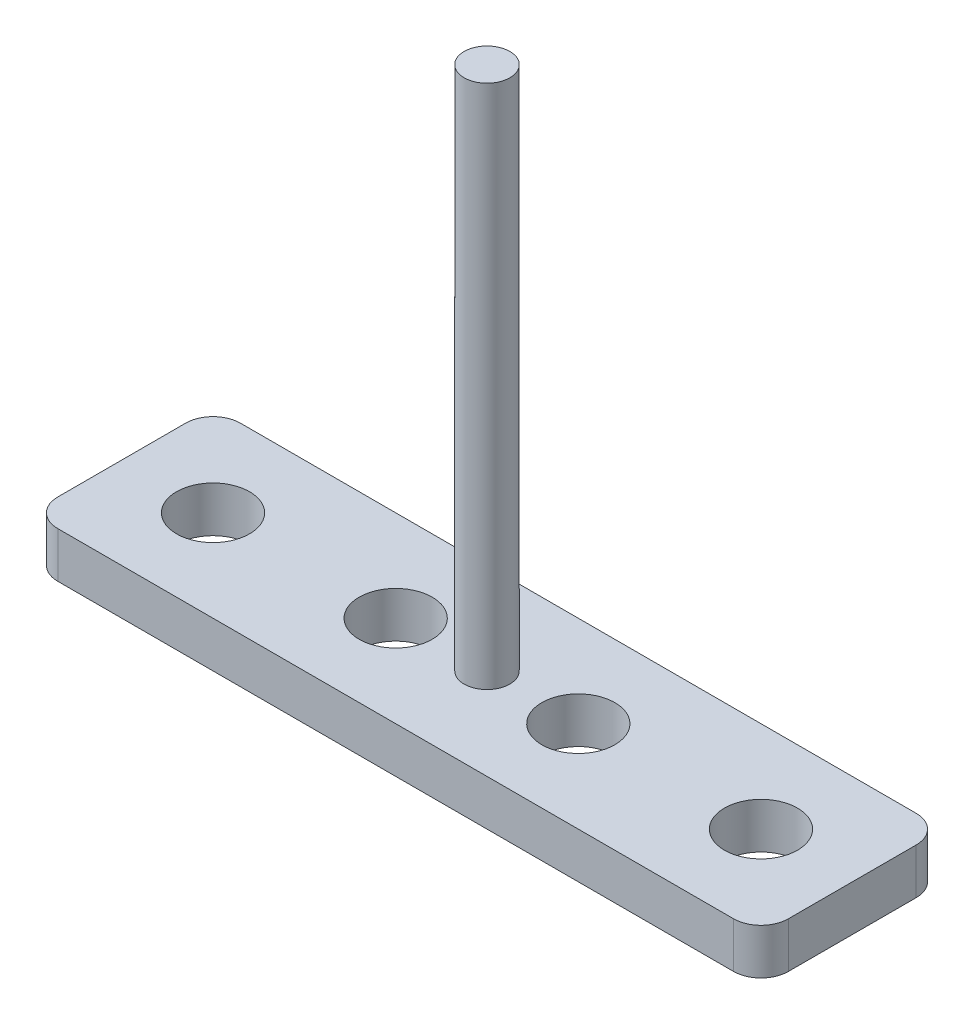
ISO-10303-21;
HEADER;
FILE_DESCRIPTION(('STEP AP214'),'2;1');
FILE_NAME('part.step','',(''),(''),'','','');
FILE_SCHEMA(('AUTOMOTIVE_DESIGN { 1 0 10303 214 1 1 1 1 }'));
ENDSEC;
DATA;
#1=APPLICATION_CONTEXT('core data for automotive mechanical design processes');
#2=APPLICATION_PROTOCOL_DEFINITION('international standard','automotive_design',2000,#1);
#3=PRODUCT_CONTEXT('',#1,'mechanical');
#4=PRODUCT('Part','Part','',(#3));
#5=PRODUCT_RELATED_PRODUCT_CATEGORY('part','',(#4));
#6=PRODUCT_DEFINITION_FORMATION('','',#4);
#7=PRODUCT_DEFINITION_CONTEXT('part definition',#1,'design');
#8=PRODUCT_DEFINITION('design','',#6,#7);
#9=PRODUCT_DEFINITION_SHAPE('','',#8);
#10=(LENGTH_UNIT() NAMED_UNIT(*) SI_UNIT(.MILLI.,.METRE.));
#11=(NAMED_UNIT(*) PLANE_ANGLE_UNIT() SI_UNIT($,.RADIAN.));
#12=(NAMED_UNIT(*) SI_UNIT($,.STERADIAN.) SOLID_ANGLE_UNIT());
#13=UNCERTAINTY_MEASURE_WITH_UNIT(LENGTH_MEASURE(1.E-05),#10,'distance_accuracy_value','');
#14=(GEOMETRIC_REPRESENTATION_CONTEXT(3) GLOBAL_UNCERTAINTY_ASSIGNED_CONTEXT((#13)) GLOBAL_UNIT_ASSIGNED_CONTEXT((#10,
#11,#12)) REPRESENTATION_CONTEXT('',''));
#15=CARTESIAN_POINT('',(0.,0.,0.));
#16=DIRECTION('',(0.,0.,1.));
#17=DIRECTION('',(1.,0.,0.));
#18=AXIS2_PLACEMENT_3D('',#15,#16,#17);
#19=CARTESIAN_POINT('',(40.,2.5,10.));
#20=DIRECTION('',(-1.,0.,0.));
#21=DIRECTION('',(0.,0.,1.));
#22=AXIS2_PLACEMENT_3D('',#19,#20,#21);
#23=PLANE('',#22);
#24=DIRECTION('',(0.,0.,-1.));
#25=VECTOR('',#24,1.);
#26=CARTESIAN_POINT('',(40.,-2.5,10.));
#27=LINE('',#26,#25);
#28=CARTESIAN_POINT('',(40.,-2.5,7.));
#29=VERTEX_POINT('',#28);
#30=CARTESIAN_POINT('',(40.,-2.5,-7.));
#31=VERTEX_POINT('',#30);
#32=EDGE_CURVE('E136',#29,#31,#27,.T.);
#33=ORIENTED_EDGE('',*,*,#32,.T.);
#34=DIRECTION('',(0.,-1.,0.));
#35=VECTOR('',#34,1.);
#36=CARTESIAN_POINT('',(40.,2.5,-7.));
#37=LINE('',#36,#35);
#38=CARTESIAN_POINT('',(40.,2.5,-7.));
#39=VERTEX_POINT('',#38);
#40=EDGE_CURVE('E111',#31,#39,#37,.F.);
#41=ORIENTED_EDGE('',*,*,#40,.T.);
#42=DIRECTION('',(0.,0.,-1.));
#43=VECTOR('',#42,1.);
#44=CARTESIAN_POINT('',(40.,2.5,10.));
#45=LINE('',#44,#43);
#46=CARTESIAN_POINT('',(40.,2.5,7.));
#47=VERTEX_POINT('',#46);
#48=EDGE_CURVE('E149',#47,#39,#45,.T.);
#49=ORIENTED_EDGE('',*,*,#48,.F.);
#50=DIRECTION('',(0.,-1.,0.));
#51=VECTOR('',#50,1.);
#52=CARTESIAN_POINT('',(40.,2.5,7.));
#53=LINE('',#52,#51);
#54=EDGE_CURVE('E117',#47,#29,#53,.T.);
#55=ORIENTED_EDGE('',*,*,#54,.T.);
#56=EDGE_LOOP('',(#33,#41,#49,#55));
#57=FACE_BOUND('',#56,.T.);
#58=ADVANCED_FACE('F39',(#57),#23,.F.);
#59=CARTESIAN_POINT('',(-40.,2.5,-10.));
#60=DIRECTION('',(0.,0.,1.));
#61=DIRECTION('',(1.,0.,0.));
#62=AXIS2_PLACEMENT_3D('',#59,#60,#61);
#63=PLANE('',#62);
#64=DIRECTION('',(-1.,0.,0.));
#65=VECTOR('',#64,1.);
#66=CARTESIAN_POINT('',(-40.,2.5,-10.));
#67=LINE('',#66,#65);
#68=CARTESIAN_POINT('',(37.,2.5,-10.));
#69=VERTEX_POINT('',#68);
#70=CARTESIAN_POINT('',(-37.,2.5,-10.));
#71=VERTEX_POINT('',#70);
#72=EDGE_CURVE('E127',#69,#71,#67,.T.);
#73=ORIENTED_EDGE('',*,*,#72,.F.);
#74=DIRECTION('',(0.,-1.,0.));
#75=VECTOR('',#74,1.);
#76=CARTESIAN_POINT('',(37.,2.5,-10.));
#77=LINE('',#76,#75);
#78=CARTESIAN_POINT('',(37.,-2.5,-10.));
#79=VERTEX_POINT('',#78);
#80=EDGE_CURVE('E110',#69,#79,#77,.T.);
#81=ORIENTED_EDGE('',*,*,#80,.T.);
#82=DIRECTION('',(-1.,0.,0.));
#83=VECTOR('',#82,1.);
#84=CARTESIAN_POINT('',(-40.,-2.5,-10.));
#85=LINE('',#84,#83);
#86=CARTESIAN_POINT('',(-37.,-2.5,-10.));
#87=VERTEX_POINT('',#86);
#88=EDGE_CURVE('E124',#79,#87,#85,.T.);
#89=ORIENTED_EDGE('',*,*,#88,.T.);
#90=DIRECTION('',(0.,-1.,0.));
#91=VECTOR('',#90,1.);
#92=CARTESIAN_POINT('',(-37.,2.5,-10.));
#93=LINE('',#92,#91);
#94=EDGE_CURVE('E130',#87,#71,#93,.F.);
#95=ORIENTED_EDGE('',*,*,#94,.T.);
#96=EDGE_LOOP('',(#73,#81,#89,#95));
#97=FACE_BOUND('',#96,.T.);
#98=ADVANCED_FACE('F123',(#97),#63,.F.);
#99=CARTESIAN_POINT('',(-40.,2.5,10.));
#100=DIRECTION('',(1.,0.,0.));
#101=DIRECTION('',(0.,0.,-1.));
#102=AXIS2_PLACEMENT_3D('',#99,#100,#101);
#103=PLANE('',#102);
#104=DIRECTION('',(0.,0.,1.));
#105=VECTOR('',#104,1.);
#106=CARTESIAN_POINT('',(-40.,-2.5,10.));
#107=LINE('',#106,#105);
#108=CARTESIAN_POINT('',(-40.,-2.5,-7.));
#109=VERTEX_POINT('',#108);
#110=CARTESIAN_POINT('',(-40.,-2.5,7.));
#111=VERTEX_POINT('',#110);
#112=EDGE_CURVE('E135',#109,#111,#107,.T.);
#113=ORIENTED_EDGE('',*,*,#112,.T.);
#114=DIRECTION('',(0.,-1.,0.));
#115=VECTOR('',#114,1.);
#116=CARTESIAN_POINT('',(-40.,2.5,7.));
#117=LINE('',#116,#115);
#118=CARTESIAN_POINT('',(-40.,2.5,7.));
#119=VERTEX_POINT('',#118);
#120=EDGE_CURVE('E11',#111,#119,#117,.F.);
#121=ORIENTED_EDGE('',*,*,#120,.T.);
#122=DIRECTION('',(0.,0.,1.));
#123=VECTOR('',#122,1.);
#124=CARTESIAN_POINT('',(-40.,2.5,10.));
#125=LINE('',#124,#123);
#126=CARTESIAN_POINT('',(-40.,2.5,-7.));
#127=VERTEX_POINT('',#126);
#128=EDGE_CURVE('E192',#127,#119,#125,.T.);
#129=ORIENTED_EDGE('',*,*,#128,.F.);
#130=DIRECTION('',(0.,-1.,0.));
#131=VECTOR('',#130,1.);
#132=CARTESIAN_POINT('',(-40.,2.5,-7.));
#133=LINE('',#132,#131);
#134=EDGE_CURVE('E48',#127,#109,#133,.T.);
#135=ORIENTED_EDGE('',*,*,#134,.T.);
#136=EDGE_LOOP('',(#113,#121,#129,#135));
#137=FACE_BOUND('',#136,.T.);
#138=ADVANCED_FACE('F190',(#137),#103,.F.);
#139=CARTESIAN_POINT('',(-40.,2.5,10.));
#140=DIRECTION('',(0.,0.,-1.));
#141=DIRECTION('',(-1.,0.,0.));
#142=AXIS2_PLACEMENT_3D('',#139,#140,#141);
#143=PLANE('',#142);
#144=DIRECTION('',(1.,0.,0.));
#145=VECTOR('',#144,1.);
#146=CARTESIAN_POINT('',(-40.,-2.5,10.));
#147=LINE('',#146,#145);
#148=CARTESIAN_POINT('',(-37.,-2.5,10.));
#149=VERTEX_POINT('',#148);
#150=CARTESIAN_POINT('',(37.,-2.5,10.));
#151=VERTEX_POINT('',#150);
#152=EDGE_CURVE('E141',#149,#151,#147,.T.);
#153=ORIENTED_EDGE('',*,*,#152,.T.);
#154=DIRECTION('',(0.,-1.,0.));
#155=VECTOR('',#154,1.);
#156=CARTESIAN_POINT('',(37.,2.5,10.));
#157=LINE('',#156,#155);
#158=CARTESIAN_POINT('',(37.,2.5,10.));
#159=VERTEX_POINT('',#158);
#160=EDGE_CURVE('E55',#151,#159,#157,.F.);
#161=ORIENTED_EDGE('',*,*,#160,.T.);
#162=DIRECTION('',(1.,0.,0.));
#163=VECTOR('',#162,1.);
#164=CARTESIAN_POINT('',(-40.,2.5,10.));
#165=LINE('',#164,#163);
#166=CARTESIAN_POINT('',(-37.,2.5,10.));
#167=VERTEX_POINT('',#166);
#168=EDGE_CURVE('E154',#167,#159,#165,.T.);
#169=ORIENTED_EDGE('',*,*,#168,.F.);
#170=DIRECTION('',(0.,-1.,0.));
#171=VECTOR('',#170,1.);
#172=CARTESIAN_POINT('',(-37.,2.5,10.));
#173=LINE('',#172,#171);
#174=EDGE_CURVE('E180',#167,#149,#173,.T.);
#175=ORIENTED_EDGE('',*,*,#174,.T.);
#176=EDGE_LOOP('',(#153,#161,#169,#175));
#177=FACE_BOUND('',#176,.T.);
#178=ADVANCED_FACE('F199',(#177),#143,.F.);
#179=CARTESIAN_POINT('',(0.,2.5,0.));
#180=DIRECTION('',(0.,-1.,0.));
#181=DIRECTION('',(0.,0.,-1.));
#182=AXIS2_PLACEMENT_3D('',#179,#180,#181);
#183=PLANE('',#182);
#184=CARTESIAN_POINT('',(0.,2.5,0.));
#185=DIRECTION('',(0.,-1.,0.));
#186=DIRECTION('',(0.,0.,-1.));
#187=AXIS2_PLACEMENT_3D('',#184,#185,#186);
#188=CIRCLE('',#187,2.5);
#189=CARTESIAN_POINT('',(0.,2.5,-2.5));
#190=VERTEX_POINT('',#189);
#191=EDGE_CURVE('E150',#190,#190,#188,.F.);
#192=ORIENTED_EDGE('',*,*,#191,.F.);
#193=EDGE_LOOP('',(#192));
#194=FACE_BOUND('',#193,.T.);
#195=CARTESIAN_POINT('',(-30.,2.5,0.));
#196=DIRECTION('',(0.,1.,0.));
#197=DIRECTION('',(0.,0.,1.));
#198=AXIS2_PLACEMENT_3D('',#195,#196,#197);
#199=CIRCLE('',#198,4.);
#200=CARTESIAN_POINT('',(-30.,2.5,4.));
#201=VERTEX_POINT('',#200);
#202=EDGE_CURVE('E237',#201,#201,#199,.T.);
#203=ORIENTED_EDGE('',*,*,#202,.F.);
#204=EDGE_LOOP('',(#203));
#205=FACE_BOUND('',#204,.T.);
#206=CARTESIAN_POINT('',(-10.,2.5,0.));
#207=DIRECTION('',(0.,1.,0.));
#208=DIRECTION('',(0.,0.,1.));
#209=AXIS2_PLACEMENT_3D('',#206,#207,#208);
#210=CIRCLE('',#209,4.);
#211=CARTESIAN_POINT('',(-10.,2.5,4.));
#212=VERTEX_POINT('',#211);
#213=EDGE_CURVE('E229',#212,#212,#210,.T.);
#214=ORIENTED_EDGE('',*,*,#213,.F.);
#215=EDGE_LOOP('',(#214));
#216=FACE_BOUND('',#215,.T.);
#217=CARTESIAN_POINT('',(10.,2.5,0.));
#218=DIRECTION('',(0.,1.,0.));
#219=DIRECTION('',(0.,0.,1.));
#220=AXIS2_PLACEMENT_3D('',#217,#218,#219);
#221=CIRCLE('',#220,4.);
#222=CARTESIAN_POINT('',(10.,2.5,4.));
#223=VERTEX_POINT('',#222);
#224=EDGE_CURVE('E221',#223,#223,#221,.T.);
#225=ORIENTED_EDGE('',*,*,#224,.F.);
#226=EDGE_LOOP('',(#225));
#227=FACE_BOUND('',#226,.T.);
#228=CARTESIAN_POINT('',(30.,2.5,0.));
#229=DIRECTION('',(0.,1.,0.));
#230=DIRECTION('',(0.,0.,1.));
#231=AXIS2_PLACEMENT_3D('',#228,#229,#230);
#232=CIRCLE('',#231,4.);
#233=CARTESIAN_POINT('',(30.,2.5,3.99999999999999));
#234=VERTEX_POINT('',#233);
#235=EDGE_CURVE('E213',#234,#234,#232,.T.);
#236=ORIENTED_EDGE('',*,*,#235,.F.);
#237=EDGE_LOOP('',(#236));
#238=FACE_BOUND('',#237,.T.);
#239=ORIENTED_EDGE('',*,*,#48,.T.);
#240=CARTESIAN_POINT('',(37.,2.5,-7.));
#241=DIRECTION('',(0.,-1.,0.));
#242=DIRECTION('',(0.,0.,-1.));
#243=AXIS2_PLACEMENT_3D('',#240,#241,#242);
#244=CIRCLE('',#243,3.);
#245=EDGE_CURVE('E177',#39,#69,#244,.F.);
#246=ORIENTED_EDGE('',*,*,#245,.T.);
#247=ORIENTED_EDGE('',*,*,#72,.T.);
#248=CARTESIAN_POINT('',(-37.,2.5,-7.));
#249=DIRECTION('',(0.,-1.,0.));
#250=DIRECTION('',(0.,0.,-1.));
#251=AXIS2_PLACEMENT_3D('',#248,#249,#250);
#252=CIRCLE('',#251,3.);
#253=EDGE_CURVE('E169',#71,#127,#252,.F.);
#254=ORIENTED_EDGE('',*,*,#253,.T.);
#255=ORIENTED_EDGE('',*,*,#128,.T.);
#256=CARTESIAN_POINT('',(-37.,2.5,7.));
#257=DIRECTION('',(0.,-1.,0.));
#258=DIRECTION('',(0.,0.,-1.));
#259=AXIS2_PLACEMENT_3D('',#256,#257,#258);
#260=CIRCLE('',#259,3.);
#261=EDGE_CURVE('E62',#119,#167,#260,.F.);
#262=ORIENTED_EDGE('',*,*,#261,.T.);
#263=ORIENTED_EDGE('',*,*,#168,.T.);
#264=CARTESIAN_POINT('',(37.,2.5,7.));
#265=DIRECTION('',(0.,-1.,0.));
#266=DIRECTION('',(0.,0.,-1.));
#267=AXIS2_PLACEMENT_3D('',#264,#265,#266);
#268=CIRCLE('',#267,3.);
#269=EDGE_CURVE('E174',#159,#47,#268,.F.);
#270=ORIENTED_EDGE('',*,*,#269,.T.);
#271=EDGE_LOOP('',(#239,#246,#247,#254,#255,#262,#263,#270));
#272=FACE_BOUND('',#271,.T.);
#273=ADVANCED_FACE('F255',(#194,#205,#216,#227,#238,#272),#183,.F.);
#274=CARTESIAN_POINT('',(0.,-2.5,0.));
#275=DIRECTION('',(0.,-1.,0.));
#276=DIRECTION('',(0.,0.,-1.));
#277=AXIS2_PLACEMENT_3D('',#274,#275,#276);
#278=PLANE('',#277);
#279=CARTESIAN_POINT('',(-30.,-2.5,0.));
#280=DIRECTION('',(0.,1.,0.));
#281=DIRECTION('',(0.,0.,1.));
#282=AXIS2_PLACEMENT_3D('',#279,#280,#281);
#283=CIRCLE('',#282,4.);
#284=CARTESIAN_POINT('',(-30.,-2.5,4.));
#285=VERTEX_POINT('',#284);
#286=EDGE_CURVE('E233',#285,#285,#283,.T.);
#287=ORIENTED_EDGE('',*,*,#286,.T.);
#288=EDGE_LOOP('',(#287));
#289=FACE_BOUND('',#288,.T.);
#290=CARTESIAN_POINT('',(-10.,-2.5,0.));
#291=DIRECTION('',(0.,1.,0.));
#292=DIRECTION('',(0.,0.,1.));
#293=AXIS2_PLACEMENT_3D('',#290,#291,#292);
#294=CIRCLE('',#293,4.);
#295=CARTESIAN_POINT('',(-10.,-2.5,4.));
#296=VERTEX_POINT('',#295);
#297=EDGE_CURVE('E225',#296,#296,#294,.T.);
#298=ORIENTED_EDGE('',*,*,#297,.T.);
#299=EDGE_LOOP('',(#298));
#300=FACE_BOUND('',#299,.T.);
#301=CARTESIAN_POINT('',(10.,-2.5,0.));
#302=DIRECTION('',(0.,1.,0.));
#303=DIRECTION('',(0.,0.,1.));
#304=AXIS2_PLACEMENT_3D('',#301,#302,#303);
#305=CIRCLE('',#304,4.);
#306=CARTESIAN_POINT('',(10.,-2.5,4.));
#307=VERTEX_POINT('',#306);
#308=EDGE_CURVE('E217',#307,#307,#305,.T.);
#309=ORIENTED_EDGE('',*,*,#308,.T.);
#310=EDGE_LOOP('',(#309));
#311=FACE_BOUND('',#310,.T.);
#312=CARTESIAN_POINT('',(30.,-2.5,0.));
#313=DIRECTION('',(0.,1.,0.));
#314=DIRECTION('',(0.,0.,1.));
#315=AXIS2_PLACEMENT_3D('',#312,#313,#314);
#316=CIRCLE('',#315,4.);
#317=CARTESIAN_POINT('',(30.,-2.5,3.99999999999999));
#318=VERTEX_POINT('',#317);
#319=EDGE_CURVE('E143',#318,#318,#316,.T.);
#320=ORIENTED_EDGE('',*,*,#319,.T.);
#321=EDGE_LOOP('',(#320));
#322=FACE_BOUND('',#321,.T.);
#323=ORIENTED_EDGE('',*,*,#88,.F.);
#324=CARTESIAN_POINT('',(37.,-2.5,-7.));
#325=DIRECTION('',(0.,-1.,0.));
#326=DIRECTION('',(0.,0.,-1.));
#327=AXIS2_PLACEMENT_3D('',#324,#325,#326);
#328=CIRCLE('',#327,3.);
#329=EDGE_CURVE('E106',#79,#31,#328,.T.);
#330=ORIENTED_EDGE('',*,*,#329,.T.);
#331=ORIENTED_EDGE('',*,*,#32,.F.);
#332=CARTESIAN_POINT('',(37.,-2.5,7.));
#333=DIRECTION('',(0.,-1.,0.));
#334=DIRECTION('',(0.,0.,-1.));
#335=AXIS2_PLACEMENT_3D('',#332,#333,#334);
#336=CIRCLE('',#335,3.);
#337=EDGE_CURVE('E118',#29,#151,#336,.T.);
#338=ORIENTED_EDGE('',*,*,#337,.T.);
#339=ORIENTED_EDGE('',*,*,#152,.F.);
#340=CARTESIAN_POINT('',(-37.,-2.5,7.));
#341=DIRECTION('',(0.,-1.,0.));
#342=DIRECTION('',(0.,0.,-1.));
#343=AXIS2_PLACEMENT_3D('',#340,#341,#342);
#344=CIRCLE('',#343,3.);
#345=EDGE_CURVE('E159',#149,#111,#344,.T.);
#346=ORIENTED_EDGE('',*,*,#345,.T.);
#347=ORIENTED_EDGE('',*,*,#112,.F.);
#348=CARTESIAN_POINT('',(-37.,-2.5,-7.));
#349=DIRECTION('',(0.,-1.,0.));
#350=DIRECTION('',(0.,0.,-1.));
#351=AXIS2_PLACEMENT_3D('',#348,#349,#350);
#352=CIRCLE('',#351,3.);
#353=EDGE_CURVE('E129',#109,#87,#352,.T.);
#354=ORIENTED_EDGE('',*,*,#353,.T.);
#355=EDGE_LOOP('',(#323,#330,#331,#338,#339,#346,#347,#354));
#356=FACE_BOUND('',#355,.T.);
#357=ADVANCED_FACE('F132',(#289,#300,#311,#322,#356),#278,.T.);
#358=CARTESIAN_POINT('',(30.,2.5,0.));
#359=DIRECTION('',(0.,1.,0.));
#360=DIRECTION('',(0.,0.,1.));
#361=AXIS2_PLACEMENT_3D('',#358,#359,#360);
#362=CYLINDRICAL_SURFACE('',#361,4.);
#363=ORIENTED_EDGE('',*,*,#319,.F.);
#364=EDGE_LOOP('',(#363));
#365=FACE_BOUND('',#364,.T.);
#366=ORIENTED_EDGE('',*,*,#235,.T.);
#367=EDGE_LOOP('',(#366));
#368=FACE_BOUND('',#367,.T.);
#369=ADVANCED_FACE('F290',(#365,#368),#362,.F.);
#370=CARTESIAN_POINT('',(10.,2.5,0.));
#371=DIRECTION('',(0.,1.,0.));
#372=DIRECTION('',(0.,0.,1.));
#373=AXIS2_PLACEMENT_3D('',#370,#371,#372);
#374=CYLINDRICAL_SURFACE('',#373,4.);
#375=ORIENTED_EDGE('',*,*,#308,.F.);
#376=EDGE_LOOP('',(#375));
#377=FACE_BOUND('',#376,.T.);
#378=ORIENTED_EDGE('',*,*,#224,.T.);
#379=EDGE_LOOP('',(#378));
#380=FACE_BOUND('',#379,.T.);
#381=ADVANCED_FACE('F295',(#377,#380),#374,.F.);
#382=CARTESIAN_POINT('',(-10.,2.5,0.));
#383=DIRECTION('',(0.,1.,0.));
#384=DIRECTION('',(0.,0.,1.));
#385=AXIS2_PLACEMENT_3D('',#382,#383,#384);
#386=CYLINDRICAL_SURFACE('',#385,4.);
#387=ORIENTED_EDGE('',*,*,#297,.F.);
#388=EDGE_LOOP('',(#387));
#389=FACE_BOUND('',#388,.T.);
#390=ORIENTED_EDGE('',*,*,#213,.T.);
#391=EDGE_LOOP('',(#390));
#392=FACE_BOUND('',#391,.T.);
#393=ADVANCED_FACE('F299',(#389,#392),#386,.F.);
#394=CARTESIAN_POINT('',(-30.,2.5,0.));
#395=DIRECTION('',(0.,1.,0.));
#396=DIRECTION('',(0.,0.,1.));
#397=AXIS2_PLACEMENT_3D('',#394,#395,#396);
#398=CYLINDRICAL_SURFACE('',#397,4.);
#399=ORIENTED_EDGE('',*,*,#286,.F.);
#400=EDGE_LOOP('',(#399));
#401=FACE_BOUND('',#400,.T.);
#402=ORIENTED_EDGE('',*,*,#202,.T.);
#403=EDGE_LOOP('',(#402));
#404=FACE_BOUND('',#403,.T.);
#405=ADVANCED_FACE('F251',(#401,#404),#398,.F.);
#406=CARTESIAN_POINT('',(0.,60.,0.));
#407=DIRECTION('',(0.,-1.,0.));
#408=DIRECTION('',(0.,0.,-1.));
#409=AXIS2_PLACEMENT_3D('',#406,#407,#408);
#410=CYLINDRICAL_SURFACE('',#409,2.5);
#411=CARTESIAN_POINT('',(0.,60.,0.));
#412=DIRECTION('',(0.,1.,0.));
#413=DIRECTION('',(0.,0.,1.));
#414=AXIS2_PLACEMENT_3D('',#411,#412,#413);
#415=CIRCLE('',#414,2.5);
#416=CARTESIAN_POINT('',(0.,60.,2.5));
#417=VERTEX_POINT('',#416);
#418=EDGE_CURVE('E241',#417,#417,#415,.T.);
#419=ORIENTED_EDGE('',*,*,#418,.F.);
#420=EDGE_LOOP('',(#419));
#421=FACE_BOUND('',#420,.T.);
#422=ORIENTED_EDGE('',*,*,#191,.T.);
#423=EDGE_LOOP('',(#422));
#424=FACE_BOUND('',#423,.T.);
#425=ADVANCED_FACE('F248',(#421,#424),#410,.T.);
#426=CARTESIAN_POINT('',(0.,60.,0.));
#427=DIRECTION('',(0.,1.,0.));
#428=DIRECTION('',(0.,0.,1.));
#429=AXIS2_PLACEMENT_3D('',#426,#427,#428);
#430=PLANE('',#429);
#431=ORIENTED_EDGE('',*,*,#418,.T.);
#432=EDGE_LOOP('',(#431));
#433=FACE_BOUND('',#432,.T.);
#434=ADVANCED_FACE('F246',(#433),#430,.T.);
#435=CARTESIAN_POINT('',(37.,2.5,-7.));
#436=DIRECTION('',(0.,-1.,0.));
#437=DIRECTION('',(0.,0.,-1.));
#438=AXIS2_PLACEMENT_3D('',#435,#436,#437);
#439=CYLINDRICAL_SURFACE('',#438,3.);
#440=ORIENTED_EDGE('',*,*,#245,.F.);
#441=ORIENTED_EDGE('',*,*,#40,.F.);
#442=ORIENTED_EDGE('',*,*,#329,.F.);
#443=ORIENTED_EDGE('',*,*,#80,.F.);
#444=EDGE_LOOP('',(#440,#441,#442,#443));
#445=FACE_BOUND('',#444,.T.);
#446=ADVANCED_FACE('F109',(#445),#439,.T.);
#447=CARTESIAN_POINT('',(37.,2.5,7.));
#448=DIRECTION('',(0.,-1.,0.));
#449=DIRECTION('',(0.,0.,-1.));
#450=AXIS2_PLACEMENT_3D('',#447,#448,#449);
#451=CYLINDRICAL_SURFACE('',#450,3.);
#452=ORIENTED_EDGE('',*,*,#269,.F.);
#453=ORIENTED_EDGE('',*,*,#160,.F.);
#454=ORIENTED_EDGE('',*,*,#337,.F.);
#455=ORIENTED_EDGE('',*,*,#54,.F.);
#456=EDGE_LOOP('',(#452,#453,#454,#455));
#457=FACE_BOUND('',#456,.T.);
#458=ADVANCED_FACE('F270',(#457),#451,.T.);
#459=CARTESIAN_POINT('',(-37.,2.5,7.));
#460=DIRECTION('',(0.,-1.,0.));
#461=DIRECTION('',(0.,0.,-1.));
#462=AXIS2_PLACEMENT_3D('',#459,#460,#461);
#463=CYLINDRICAL_SURFACE('',#462,3.);
#464=ORIENTED_EDGE('',*,*,#261,.F.);
#465=ORIENTED_EDGE('',*,*,#120,.F.);
#466=ORIENTED_EDGE('',*,*,#345,.F.);
#467=ORIENTED_EDGE('',*,*,#174,.F.);
#468=EDGE_LOOP('',(#464,#465,#466,#467));
#469=FACE_BOUND('',#468,.T.);
#470=ADVANCED_FACE('F198',(#469),#463,.T.);
#471=CARTESIAN_POINT('',(-37.,2.5,-7.));
#472=DIRECTION('',(0.,-1.,0.));
#473=DIRECTION('',(0.,0.,-1.));
#474=AXIS2_PLACEMENT_3D('',#471,#472,#473);
#475=CYLINDRICAL_SURFACE('',#474,3.);
#476=ORIENTED_EDGE('',*,*,#253,.F.);
#477=ORIENTED_EDGE('',*,*,#94,.F.);
#478=ORIENTED_EDGE('',*,*,#353,.F.);
#479=ORIENTED_EDGE('',*,*,#134,.F.);
#480=EDGE_LOOP('',(#476,#477,#478,#479));
#481=FACE_BOUND('',#480,.T.);
#482=ADVANCED_FACE('F41',(#481),#475,.T.);
#483=CLOSED_SHELL('',(#58,#98,#138,#178,#273,#357,#369,#381,#393,#405,#425,#434,#446,#458,#470,#482));
#484=MANIFOLD_SOLID_BREP('B2',#483);
#485=ADVANCED_BREP_SHAPE_REPRESENTATION('',(#18,#484),#14);
#486=SHAPE_DEFINITION_REPRESENTATION(#9,#485);
ENDSEC;
END-ISO-10303-21;
